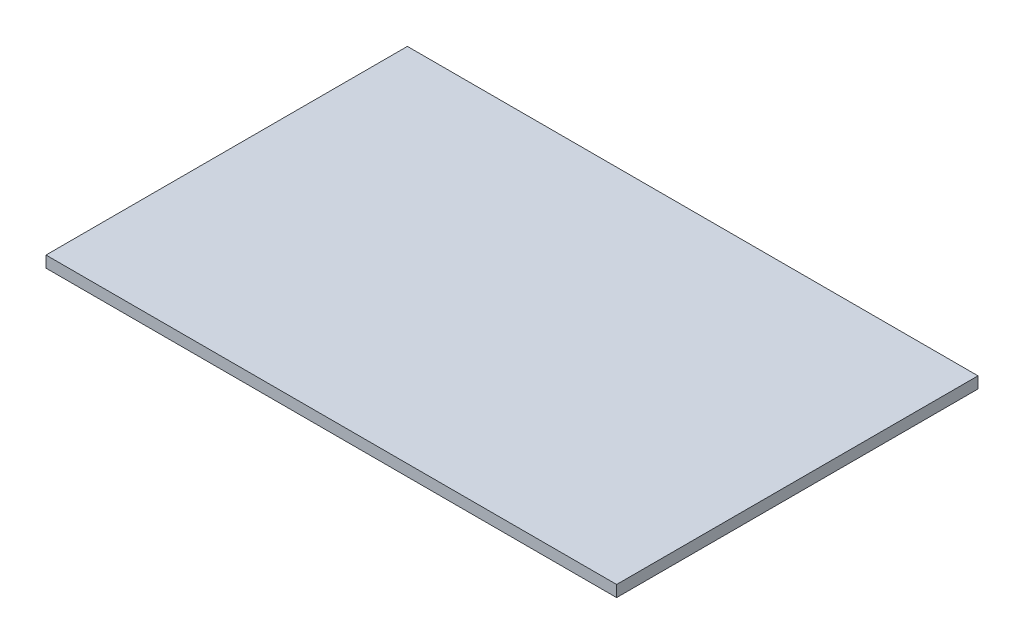
ISO-10303-21;
HEADER;
FILE_DESCRIPTION(('STEP AP214'),'2;1');
FILE_NAME('part.step','',(''),(''),'','','');
FILE_SCHEMA(('AUTOMOTIVE_DESIGN { 1 0 10303 214 1 1 1 1 }'));
ENDSEC;
DATA;
#1=APPLICATION_CONTEXT('core data for automotive mechanical design processes');
#2=APPLICATION_PROTOCOL_DEFINITION('international standard','automotive_design',2000,#1);
#3=PRODUCT_CONTEXT('',#1,'mechanical');
#4=PRODUCT('Part','Part','',(#3));
#5=PRODUCT_RELATED_PRODUCT_CATEGORY('part','',(#4));
#6=PRODUCT_DEFINITION_FORMATION('','',#4);
#7=PRODUCT_DEFINITION_CONTEXT('part definition',#1,'design');
#8=PRODUCT_DEFINITION('design','',#6,#7);
#9=PRODUCT_DEFINITION_SHAPE('','',#8);
#10=(LENGTH_UNIT() NAMED_UNIT(*) SI_UNIT(.MILLI.,.METRE.));
#11=(NAMED_UNIT(*) PLANE_ANGLE_UNIT() SI_UNIT($,.RADIAN.));
#12=(NAMED_UNIT(*) SI_UNIT($,.STERADIAN.) SOLID_ANGLE_UNIT());
#13=UNCERTAINTY_MEASURE_WITH_UNIT(LENGTH_MEASURE(1.E-05),#10,'distance_accuracy_value','');
#14=(GEOMETRIC_REPRESENTATION_CONTEXT(3) GLOBAL_UNCERTAINTY_ASSIGNED_CONTEXT((#13)) GLOBAL_UNIT_ASSIGNED_CONTEXT((#10,
#11,#12)) REPRESENTATION_CONTEXT('',''));
#15=CARTESIAN_POINT('',(0.,0.,0.));
#16=DIRECTION('',(0.,0.,1.));
#17=DIRECTION('',(1.,0.,0.));
#18=AXIS2_PLACEMENT_3D('',#15,#16,#17);
#19=CARTESIAN_POINT('',(-476.25,-19.05,-298.45));
#20=DIRECTION('',(0.,0.,-1.));
#21=DIRECTION('',(-1.,0.,0.));
#22=AXIS2_PLACEMENT_3D('',#19,#20,#21);
#23=PLANE('',#22);
#24=DIRECTION('',(-1.,0.,0.));
#25=VECTOR('',#24,1.);
#26=CARTESIAN_POINT('',(-476.25,0.,-298.45));
#27=LINE('',#26,#25);
#28=CARTESIAN_POINT('',(476.25,0.,-298.45));
#29=VERTEX_POINT('',#28);
#30=CARTESIAN_POINT('',(-476.25,0.,-298.45));
#31=VERTEX_POINT('',#30);
#32=EDGE_CURVE('E111',#29,#31,#27,.T.);
#33=ORIENTED_EDGE('',*,*,#32,.F.);
#34=DIRECTION('',(0.,1.,0.));
#35=VECTOR('',#34,1.);
#36=CARTESIAN_POINT('',(476.25,-19.05,-298.45));
#37=LINE('',#36,#35);
#38=CARTESIAN_POINT('',(476.25,-19.05,-298.45));
#39=VERTEX_POINT('',#38);
#40=EDGE_CURVE('E11',#39,#29,#37,.T.);
#41=ORIENTED_EDGE('',*,*,#40,.F.);
#42=DIRECTION('',(-1.,0.,0.));
#43=VECTOR('',#42,1.);
#44=CARTESIAN_POINT('',(-476.25,-19.05,-298.45));
#45=LINE('',#44,#43);
#46=CARTESIAN_POINT('',(-476.25,-19.05,-298.45));
#47=VERTEX_POINT('',#46);
#48=EDGE_CURVE('E102',#39,#47,#45,.T.);
#49=ORIENTED_EDGE('',*,*,#48,.T.);
#50=DIRECTION('',(0.,1.,0.));
#51=VECTOR('',#50,1.);
#52=CARTESIAN_POINT('',(-476.25,-19.05,-298.45));
#53=LINE('',#52,#51);
#54=EDGE_CURVE('E43',#47,#31,#53,.T.);
#55=ORIENTED_EDGE('',*,*,#54,.T.);
#56=EDGE_LOOP('',(#33,#41,#49,#55));
#57=FACE_BOUND('',#56,.T.);
#58=ADVANCED_FACE('F40',(#57),#23,.T.);
#59=CARTESIAN_POINT('',(476.25,-19.05,-298.45));
#60=DIRECTION('',(1.,0.,0.));
#61=DIRECTION('',(0.,0.,-1.));
#62=AXIS2_PLACEMENT_3D('',#59,#60,#61);
#63=PLANE('',#62);
#64=DIRECTION('',(0.,0.,-1.));
#65=VECTOR('',#64,1.);
#66=CARTESIAN_POINT('',(476.25,0.,-298.45));
#67=LINE('',#66,#65);
#68=CARTESIAN_POINT('',(476.25,0.,304.8));
#69=VERTEX_POINT('',#68);
#70=EDGE_CURVE('E106',#69,#29,#67,.T.);
#71=ORIENTED_EDGE('',*,*,#70,.F.);
#72=DIRECTION('',(0.,1.,0.));
#73=VECTOR('',#72,1.);
#74=CARTESIAN_POINT('',(476.25,-19.05,304.8));
#75=LINE('',#74,#73);
#76=CARTESIAN_POINT('',(476.25,-19.05,304.8));
#77=VERTEX_POINT('',#76);
#78=EDGE_CURVE('E50',#77,#69,#75,.T.);
#79=ORIENTED_EDGE('',*,*,#78,.F.);
#80=DIRECTION('',(0.,0.,-1.));
#81=VECTOR('',#80,1.);
#82=CARTESIAN_POINT('',(476.25,-19.05,-298.45));
#83=LINE('',#82,#81);
#84=EDGE_CURVE('E97',#77,#39,#83,.T.);
#85=ORIENTED_EDGE('',*,*,#84,.T.);
#86=ORIENTED_EDGE('',*,*,#40,.T.);
#87=EDGE_LOOP('',(#71,#79,#85,#86));
#88=FACE_BOUND('',#87,.T.);
#89=ADVANCED_FACE('F133',(#88),#63,.T.);
#90=CARTESIAN_POINT('',(-476.25,-19.05,304.8));
#91=DIRECTION('',(0.,0.,1.));
#92=DIRECTION('',(1.,0.,0.));
#93=AXIS2_PLACEMENT_3D('',#90,#91,#92);
#94=PLANE('',#93);
#95=DIRECTION('',(1.,0.,0.));
#96=VECTOR('',#95,1.);
#97=CARTESIAN_POINT('',(-476.25,0.,304.8));
#98=LINE('',#97,#96);
#99=CARTESIAN_POINT('',(-476.25,0.,304.8));
#100=VERTEX_POINT('',#99);
#101=EDGE_CURVE('E91',#100,#69,#98,.T.);
#102=ORIENTED_EDGE('',*,*,#101,.F.);
#103=DIRECTION('',(0.,1.,0.));
#104=VECTOR('',#103,1.);
#105=CARTESIAN_POINT('',(-476.25,-19.05,304.8));
#106=LINE('',#105,#104);
#107=CARTESIAN_POINT('',(-476.25,-19.05,304.8));
#108=VERTEX_POINT('',#107);
#109=EDGE_CURVE('E86',#108,#100,#106,.T.);
#110=ORIENTED_EDGE('',*,*,#109,.F.);
#111=DIRECTION('',(1.,0.,0.));
#112=VECTOR('',#111,1.);
#113=CARTESIAN_POINT('',(-476.25,-19.05,304.8));
#114=LINE('',#113,#112);
#115=EDGE_CURVE('E89',#108,#77,#114,.T.);
#116=ORIENTED_EDGE('',*,*,#115,.T.);
#117=ORIENTED_EDGE('',*,*,#78,.T.);
#118=EDGE_LOOP('',(#102,#110,#116,#117));
#119=FACE_BOUND('',#118,.T.);
#120=ADVANCED_FACE('F88',(#119),#94,.T.);
#121=CARTESIAN_POINT('',(-476.25,-19.05,-298.45));
#122=DIRECTION('',(-1.,0.,0.));
#123=DIRECTION('',(0.,0.,1.));
#124=AXIS2_PLACEMENT_3D('',#121,#122,#123);
#125=PLANE('',#124);
#126=DIRECTION('',(0.,0.,1.));
#127=VECTOR('',#126,1.);
#128=CARTESIAN_POINT('',(-476.25,0.,-298.45));
#129=LINE('',#128,#127);
#130=EDGE_CURVE('E115',#31,#100,#129,.T.);
#131=ORIENTED_EDGE('',*,*,#130,.F.);
#132=ORIENTED_EDGE('',*,*,#54,.F.);
#133=DIRECTION('',(0.,0.,1.));
#134=VECTOR('',#133,1.);
#135=CARTESIAN_POINT('',(-476.25,-19.05,-298.45));
#136=LINE('',#135,#134);
#137=EDGE_CURVE('E96',#47,#108,#136,.T.);
#138=ORIENTED_EDGE('',*,*,#137,.T.);
#139=ORIENTED_EDGE('',*,*,#109,.T.);
#140=EDGE_LOOP('',(#131,#132,#138,#139));
#141=FACE_BOUND('',#140,.T.);
#142=ADVANCED_FACE('F100',(#141),#125,.T.);
#143=CARTESIAN_POINT('',(0.,-19.05,0.));
#144=DIRECTION('',(0.,-1.,0.));
#145=DIRECTION('',(0.,0.,-1.));
#146=AXIS2_PLACEMENT_3D('',#143,#144,#145);
#147=PLANE('',#146);
#148=ORIENTED_EDGE('',*,*,#48,.F.);
#149=ORIENTED_EDGE('',*,*,#84,.F.);
#150=ORIENTED_EDGE('',*,*,#115,.F.);
#151=ORIENTED_EDGE('',*,*,#137,.F.);
#152=EDGE_LOOP('',(#148,#149,#150,#151));
#153=FACE_BOUND('',#152,.T.);
#154=ADVANCED_FACE('F95',(#153),#147,.T.);
#155=CARTESIAN_POINT('',(0.,0.,0.));
#156=DIRECTION('',(0.,-1.,0.));
#157=DIRECTION('',(0.,0.,-1.));
#158=AXIS2_PLACEMENT_3D('',#155,#156,#157);
#159=PLANE('',#158);
#160=ORIENTED_EDGE('',*,*,#32,.T.);
#161=ORIENTED_EDGE('',*,*,#130,.T.);
#162=ORIENTED_EDGE('',*,*,#101,.T.);
#163=ORIENTED_EDGE('',*,*,#70,.T.);
#164=EDGE_LOOP('',(#160,#161,#162,#163));
#165=FACE_BOUND('',#164,.T.);
#166=ADVANCED_FACE('F132',(#165),#159,.F.);
#167=CLOSED_SHELL('',(#58,#89,#120,#142,#154,#166));
#168=MANIFOLD_SOLID_BREP('B2',#167);
#169=ADVANCED_BREP_SHAPE_REPRESENTATION('',(#18,#168),#14);
#170=SHAPE_DEFINITION_REPRESENTATION(#9,#169);
ENDSEC;
END-ISO-10303-21;
